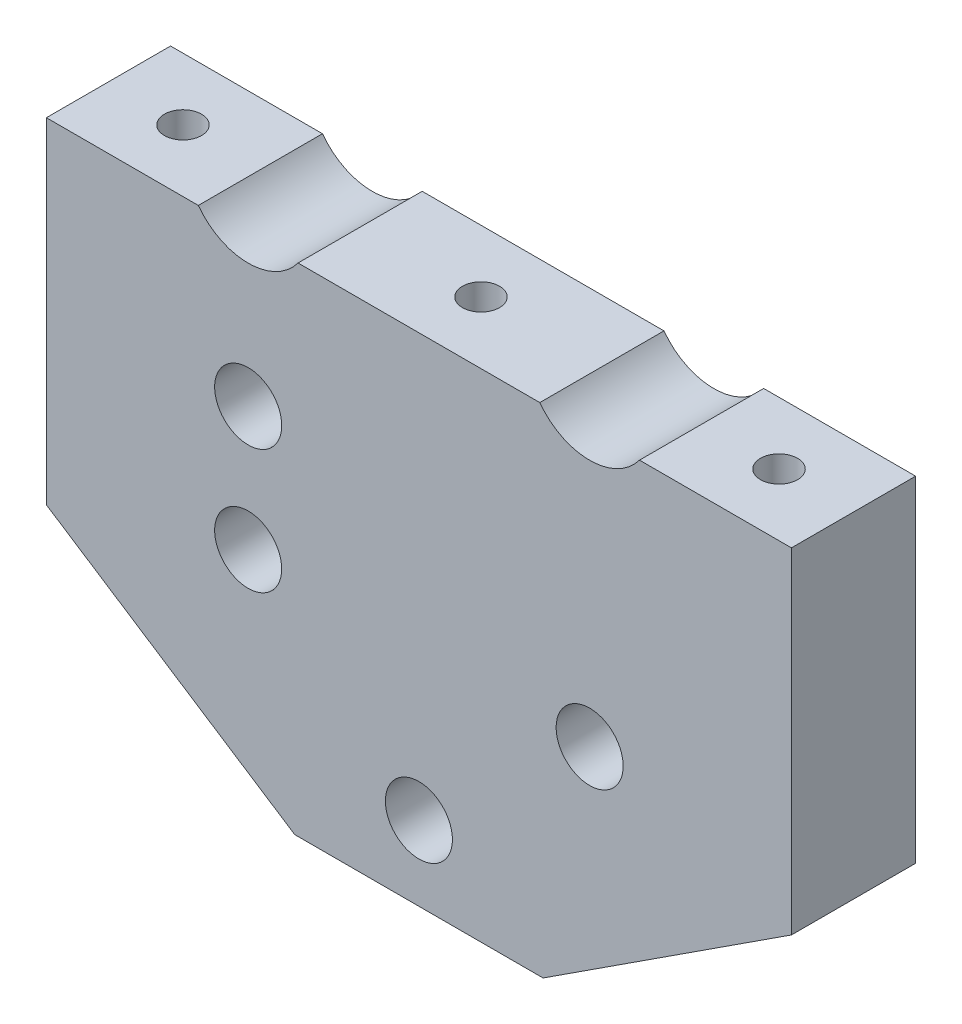
ISO-10303-21;
HEADER;
FILE_DESCRIPTION(('STEP AP214'),'2;1');
FILE_NAME('part.step','',(''),(''),'','','');
FILE_SCHEMA(('AUTOMOTIVE_DESIGN { 1 0 10303 214 1 1 1 1 }'));
ENDSEC;
DATA;
#1=APPLICATION_CONTEXT('core data for automotive mechanical design processes');
#2=APPLICATION_PROTOCOL_DEFINITION('international standard','automotive_design',2000,#1);
#3=PRODUCT_CONTEXT('',#1,'mechanical');
#4=PRODUCT('Part','Part','',(#3));
#5=PRODUCT_RELATED_PRODUCT_CATEGORY('part','',(#4));
#6=PRODUCT_DEFINITION_FORMATION('','',#4);
#7=PRODUCT_DEFINITION_CONTEXT('part definition',#1,'design');
#8=PRODUCT_DEFINITION('design','',#6,#7);
#9=PRODUCT_DEFINITION_SHAPE('','',#8);
#10=(LENGTH_UNIT() NAMED_UNIT(*) SI_UNIT(.MILLI.,.METRE.));
#11=(NAMED_UNIT(*) PLANE_ANGLE_UNIT() SI_UNIT($,.RADIAN.));
#12=(NAMED_UNIT(*) SI_UNIT($,.STERADIAN.) SOLID_ANGLE_UNIT());
#13=UNCERTAINTY_MEASURE_WITH_UNIT(LENGTH_MEASURE(1.E-05),#10,'distance_accuracy_value','');
#14=(GEOMETRIC_REPRESENTATION_CONTEXT(3) GLOBAL_UNCERTAINTY_ASSIGNED_CONTEXT((#13)) GLOBAL_UNIT_ASSIGNED_CONTEXT((#10,
#11,#12)) REPRESENTATION_CONTEXT('',''));
#15=CARTESIAN_POINT('',(0.,0.,0.));
#16=DIRECTION('',(0.,0.,1.));
#17=DIRECTION('',(1.,0.,0.));
#18=AXIS2_PLACEMENT_3D('',#15,#16,#17);
#19=CARTESIAN_POINT('',(-17.4625,20.9296,12.7));
#20=DIRECTION('',(0.,0.,1.));
#21=DIRECTION('',(1.,0.,0.));
#22=AXIS2_PLACEMENT_3D('',#19,#20,#21);
#23=PLANE('',#22);
#24=CARTESIAN_POINT('',(-17.4625,1.905,12.7));
#25=DIRECTION('',(0.,0.,1.));
#26=DIRECTION('',(1.,0.,0.));
#27=AXIS2_PLACEMENT_3D('',#24,#25,#26);
#28=CIRCLE('',#27,3.429);
#29=CARTESIAN_POINT('',(-14.0335,1.905,12.7));
#30=VERTEX_POINT('',#29);
#31=EDGE_CURVE('E271',#30,#30,#28,.T.);
#32=ORIENTED_EDGE('',*,*,#31,.F.);
#33=EDGE_LOOP('',(#32));
#34=FACE_BOUND('',#33,.T.);
#35=CARTESIAN_POINT('',(-17.4625,-10.795,12.7));
#36=DIRECTION('',(0.,0.,1.));
#37=DIRECTION('',(1.,0.,0.));
#38=AXIS2_PLACEMENT_3D('',#35,#36,#37);
#39=CIRCLE('',#38,3.429);
#40=CARTESIAN_POINT('',(-14.0335,-10.795,12.7));
#41=VERTEX_POINT('',#40);
#42=EDGE_CURVE('E172',#41,#41,#39,.T.);
#43=ORIENTED_EDGE('',*,*,#42,.F.);
#44=EDGE_LOOP('',(#43));
#45=FACE_BOUND('',#44,.T.);
#46=DIRECTION('',(-1.,0.,0.));
#47=VECTOR('',#46,1.);
#48=CARTESIAN_POINT('',(22.5614511509721,17.145,12.7));
#49=LINE('',#48,#47);
#50=CARTESIAN_POINT('',(38.1,17.145,12.7));
#51=VERTEX_POINT('',#50);
#52=CARTESIAN_POINT('',(22.5614511509721,17.145,12.7));
#53=VERTEX_POINT('',#52);
#54=EDGE_CURVE('E196',#51,#53,#49,.T.);
#55=ORIENTED_EDGE('',*,*,#54,.T.);
#56=CARTESIAN_POINT('',(17.4625,20.9296,12.7));
#57=DIRECTION('',(0.,0.,-1.));
#58=DIRECTION('',(-1.,0.,0.));
#59=AXIS2_PLACEMENT_3D('',#56,#57,#58);
#60=CIRCLE('',#59,6.35);
#61=CARTESIAN_POINT('',(12.3635488490279,17.145,12.7));
#62=VERTEX_POINT('',#61);
#63=EDGE_CURVE('E118',#53,#62,#60,.T.);
#64=ORIENTED_EDGE('',*,*,#63,.T.);
#65=DIRECTION('',(-1.,0.,0.));
#66=VECTOR('',#65,1.);
#67=CARTESIAN_POINT('',(-12.3635488490279,17.145,12.7));
#68=LINE('',#67,#66);
#69=CARTESIAN_POINT('',(-12.3635488490279,17.145,12.7));
#70=VERTEX_POINT('',#69);
#71=EDGE_CURVE('E225',#62,#70,#68,.T.);
#72=ORIENTED_EDGE('',*,*,#71,.T.);
#73=CARTESIAN_POINT('',(-17.4625,20.9296,12.7));
#74=DIRECTION('',(0.,0.,-1.));
#75=DIRECTION('',(1.,0.,0.));
#76=AXIS2_PLACEMENT_3D('',#73,#74,#75);
#77=CIRCLE('',#76,6.35);
#78=CARTESIAN_POINT('',(-22.5614511509721,17.145,12.7));
#79=VERTEX_POINT('',#78);
#80=EDGE_CURVE('E245',#70,#79,#77,.T.);
#81=ORIENTED_EDGE('',*,*,#80,.T.);
#82=DIRECTION('',(-1.,0.,0.));
#83=VECTOR('',#82,1.);
#84=CARTESIAN_POINT('',(-38.1,17.145,12.7));
#85=LINE('',#84,#83);
#86=CARTESIAN_POINT('',(-38.1,17.145,12.7));
#87=VERTEX_POINT('',#86);
#88=EDGE_CURVE('E241',#79,#87,#85,.T.);
#89=ORIENTED_EDGE('',*,*,#88,.T.);
#90=DIRECTION('',(0.,-1.,0.));
#91=VECTOR('',#90,1.);
#92=CARTESIAN_POINT('',(-38.1,-17.145,12.7));
#93=LINE('',#92,#91);
#94=CARTESIAN_POINT('',(-38.1,-17.145,12.7));
#95=VERTEX_POINT('',#94);
#96=EDGE_CURVE('E244',#87,#95,#93,.T.);
#97=ORIENTED_EDGE('',*,*,#96,.T.);
#98=DIRECTION('',(0.838443616300637,-0.544988350595414,0.));
#99=VECTOR('',#98,1.);
#100=CARTESIAN_POINT('',(-38.1,-17.145,12.7));
#101=LINE('',#100,#99);
#102=CARTESIAN_POINT('',(-12.7,-33.655,12.7));
#103=VERTEX_POINT('',#102);
#104=EDGE_CURVE('E145',#95,#103,#101,.T.);
#105=ORIENTED_EDGE('',*,*,#104,.T.);
#106=DIRECTION('',(1.,0.,0.));
#107=VECTOR('',#106,1.);
#108=CARTESIAN_POINT('',(-12.7,-33.655,12.7));
#109=LINE('',#108,#107);
#110=CARTESIAN_POINT('',(12.7,-33.655,12.7));
#111=VERTEX_POINT('',#110);
#112=EDGE_CURVE('E139',#103,#111,#109,.T.);
#113=ORIENTED_EDGE('',*,*,#112,.T.);
#114=DIRECTION('',(0.838443616300638,0.544988350595414,0.));
#115=VECTOR('',#114,1.);
#116=CARTESIAN_POINT('',(38.1,-17.145,12.7));
#117=LINE('',#116,#115);
#118=CARTESIAN_POINT('',(38.1,-17.145,12.7));
#119=VERTEX_POINT('',#118);
#120=EDGE_CURVE('E143',#111,#119,#117,.T.);
#121=ORIENTED_EDGE('',*,*,#120,.T.);
#122=DIRECTION('',(0.,1.,0.));
#123=VECTOR('',#122,1.);
#124=CARTESIAN_POINT('',(38.1,-17.145,12.7));
#125=LINE('',#124,#123);
#126=EDGE_CURVE('E68',#119,#51,#125,.T.);
#127=ORIENTED_EDGE('',*,*,#126,.T.);
#128=EDGE_LOOP('',(#55,#64,#72,#81,#89,#97,#105,#113,#121,#127));
#129=FACE_BOUND('',#128,.T.);
#130=CARTESIAN_POINT('',(17.4625,-10.795,12.7));
#131=DIRECTION('',(0.,0.,1.));
#132=DIRECTION('',(-1.,0.,0.));
#133=AXIS2_PLACEMENT_3D('',#130,#131,#132);
#134=CIRCLE('',#133,3.429);
#135=CARTESIAN_POINT('',(14.0335,-10.795,12.7));
#136=VERTEX_POINT('',#135);
#137=EDGE_CURVE('E263',#136,#136,#134,.T.);
#138=ORIENTED_EDGE('',*,*,#137,.F.);
#139=EDGE_LOOP('',(#138));
#140=FACE_BOUND('',#139,.T.);
#141=CARTESIAN_POINT('',(0.,-26.035,12.7));
#142=DIRECTION('',(0.,0.,1.));
#143=DIRECTION('',(1.,0.,0.));
#144=AXIS2_PLACEMENT_3D('',#141,#142,#143);
#145=CIRCLE('',#144,3.429);
#146=CARTESIAN_POINT('',(3.42900000000001,-26.035,12.7));
#147=VERTEX_POINT('',#146);
#148=EDGE_CURVE('E279',#147,#147,#145,.T.);
#149=ORIENTED_EDGE('',*,*,#148,.F.);
#150=EDGE_LOOP('',(#149));
#151=FACE_BOUND('',#150,.T.);
#152=ADVANCED_FACE('F50',(#34,#45,#129,#140,#151),#23,.T.);
#153=CARTESIAN_POINT('',(-17.4625,20.9296,0.));
#154=DIRECTION('',(0.,0.,1.));
#155=DIRECTION('',(1.,0.,0.));
#156=AXIS2_PLACEMENT_3D('',#153,#154,#155);
#157=PLANE('',#156);
#158=DIRECTION('',(-1.,0.,0.));
#159=VECTOR('',#158,1.);
#160=CARTESIAN_POINT('',(22.5614511509721,17.145,0.));
#161=LINE('',#160,#159);
#162=CARTESIAN_POINT('',(38.1,17.145,0.));
#163=VERTEX_POINT('',#162);
#164=CARTESIAN_POINT('',(22.5614511509721,17.145,0.));
#165=VERTEX_POINT('',#164);
#166=EDGE_CURVE('E167',#163,#165,#161,.T.);
#167=ORIENTED_EDGE('',*,*,#166,.F.);
#168=DIRECTION('',(0.,1.,0.));
#169=VECTOR('',#168,1.);
#170=CARTESIAN_POINT('',(38.1,-17.145,0.));
#171=LINE('',#170,#169);
#172=CARTESIAN_POINT('',(38.1,-17.145,0.));
#173=VERTEX_POINT('',#172);
#174=EDGE_CURVE('E110',#173,#163,#171,.T.);
#175=ORIENTED_EDGE('',*,*,#174,.F.);
#176=DIRECTION('',(0.838443616300638,0.544988350595414,0.));
#177=VECTOR('',#176,1.);
#178=CARTESIAN_POINT('',(38.1,-17.145,0.));
#179=LINE('',#178,#177);
#180=CARTESIAN_POINT('',(12.7,-33.655,0.));
#181=VERTEX_POINT('',#180);
#182=EDGE_CURVE('E104',#181,#173,#179,.T.);
#183=ORIENTED_EDGE('',*,*,#182,.F.);
#184=DIRECTION('',(1.,0.,0.));
#185=VECTOR('',#184,1.);
#186=CARTESIAN_POINT('',(-12.7,-33.655,0.));
#187=LINE('',#186,#185);
#188=CARTESIAN_POINT('',(-12.7,-33.655,0.));
#189=VERTEX_POINT('',#188);
#190=EDGE_CURVE('E154',#189,#181,#187,.T.);
#191=ORIENTED_EDGE('',*,*,#190,.F.);
#192=DIRECTION('',(0.838443616300637,-0.544988350595414,0.));
#193=VECTOR('',#192,1.);
#194=CARTESIAN_POINT('',(-38.1,-17.145,0.));
#195=LINE('',#194,#193);
#196=CARTESIAN_POINT('',(-38.1,-17.145,0.));
#197=VERTEX_POINT('',#196);
#198=EDGE_CURVE('E187',#197,#189,#195,.T.);
#199=ORIENTED_EDGE('',*,*,#198,.F.);
#200=DIRECTION('',(0.,-1.,0.));
#201=VECTOR('',#200,1.);
#202=CARTESIAN_POINT('',(-38.1,-17.145,0.));
#203=LINE('',#202,#201);
#204=CARTESIAN_POINT('',(-38.1,17.145,0.));
#205=VERTEX_POINT('',#204);
#206=EDGE_CURVE('E184',#205,#197,#203,.T.);
#207=ORIENTED_EDGE('',*,*,#206,.F.);
#208=DIRECTION('',(-1.,0.,0.));
#209=VECTOR('',#208,1.);
#210=CARTESIAN_POINT('',(-38.1,17.145,0.));
#211=LINE('',#210,#209);
#212=CARTESIAN_POINT('',(-22.5614511509721,17.145,0.));
#213=VERTEX_POINT('',#212);
#214=EDGE_CURVE('E181',#213,#205,#211,.T.);
#215=ORIENTED_EDGE('',*,*,#214,.F.);
#216=CARTESIAN_POINT('',(-17.4625,20.9296,0.));
#217=DIRECTION('',(0.,0.,-1.));
#218=DIRECTION('',(1.,0.,0.));
#219=AXIS2_PLACEMENT_3D('',#216,#217,#218);
#220=CIRCLE('',#219,6.35);
#221=CARTESIAN_POINT('',(-12.3635488490279,17.145,0.));
#222=VERTEX_POINT('',#221);
#223=EDGE_CURVE('E178',#222,#213,#220,.T.);
#224=ORIENTED_EDGE('',*,*,#223,.F.);
#225=DIRECTION('',(-1.,0.,0.));
#226=VECTOR('',#225,1.);
#227=CARTESIAN_POINT('',(-12.3635488490279,17.145,0.));
#228=LINE('',#227,#226);
#229=CARTESIAN_POINT('',(12.3635488490279,17.145,0.));
#230=VERTEX_POINT('',#229);
#231=EDGE_CURVE('E175',#230,#222,#228,.T.);
#232=ORIENTED_EDGE('',*,*,#231,.F.);
#233=CARTESIAN_POINT('',(17.4625,20.9296,0.));
#234=DIRECTION('',(0.,0.,-1.));
#235=DIRECTION('',(-1.,0.,0.));
#236=AXIS2_PLACEMENT_3D('',#233,#234,#235);
#237=CIRCLE('',#236,6.35);
#238=EDGE_CURVE('E171',#165,#230,#237,.T.);
#239=ORIENTED_EDGE('',*,*,#238,.F.);
#240=EDGE_LOOP('',(#167,#175,#183,#191,#199,#207,#215,#224,#232,#239));
#241=FACE_BOUND('',#240,.T.);
#242=CARTESIAN_POINT('',(-17.4625,-10.795,0.));
#243=DIRECTION('',(0.,0.,1.));
#244=DIRECTION('',(1.,0.,0.));
#245=AXIS2_PLACEMENT_3D('',#242,#243,#244);
#246=CIRCLE('',#245,3.429);
#247=CARTESIAN_POINT('',(-14.0335,-10.795,0.));
#248=VERTEX_POINT('',#247);
#249=EDGE_CURVE('E259',#248,#248,#246,.T.);
#250=ORIENTED_EDGE('',*,*,#249,.T.);
#251=EDGE_LOOP('',(#250));
#252=FACE_BOUND('',#251,.T.);
#253=CARTESIAN_POINT('',(17.4625,-10.795,0.));
#254=DIRECTION('',(0.,0.,1.));
#255=DIRECTION('',(-1.,0.,0.));
#256=AXIS2_PLACEMENT_3D('',#253,#254,#255);
#257=CIRCLE('',#256,3.429);
#258=CARTESIAN_POINT('',(14.0335,-10.795,0.));
#259=VERTEX_POINT('',#258);
#260=EDGE_CURVE('E267',#259,#259,#257,.T.);
#261=ORIENTED_EDGE('',*,*,#260,.T.);
#262=EDGE_LOOP('',(#261));
#263=FACE_BOUND('',#262,.T.);
#264=CARTESIAN_POINT('',(-17.4625,1.905,0.));
#265=DIRECTION('',(0.,0.,1.));
#266=DIRECTION('',(1.,0.,0.));
#267=AXIS2_PLACEMENT_3D('',#264,#265,#266);
#268=CIRCLE('',#267,3.429);
#269=CARTESIAN_POINT('',(-14.0335,1.905,0.));
#270=VERTEX_POINT('',#269);
#271=EDGE_CURVE('E275',#270,#270,#268,.T.);
#272=ORIENTED_EDGE('',*,*,#271,.T.);
#273=EDGE_LOOP('',(#272));
#274=FACE_BOUND('',#273,.T.);
#275=CARTESIAN_POINT('',(0.,-26.035,0.));
#276=DIRECTION('',(0.,0.,1.));
#277=DIRECTION('',(1.,0.,0.));
#278=AXIS2_PLACEMENT_3D('',#275,#276,#277);
#279=CIRCLE('',#278,3.429);
#280=CARTESIAN_POINT('',(3.42900000000001,-26.035,0.));
#281=VERTEX_POINT('',#280);
#282=EDGE_CURVE('E283',#281,#281,#279,.T.);
#283=ORIENTED_EDGE('',*,*,#282,.T.);
#284=EDGE_LOOP('',(#283));
#285=FACE_BOUND('',#284,.T.);
#286=ADVANCED_FACE('F229',(#241,#252,#263,#274,#285),#157,.F.);
#287=CARTESIAN_POINT('',(22.5614511509721,17.145,12.7));
#288=DIRECTION('',(0.,-1.,0.));
#289=DIRECTION('',(0.,0.,-1.));
#290=AXIS2_PLACEMENT_3D('',#287,#288,#289);
#291=PLANE('',#290);
#292=CARTESIAN_POINT('',(30.48,17.145,6.35000000000001));
#293=DIRECTION('',(0.,1.,0.));
#294=DIRECTION('',(0.,0.,1.));
#295=AXIS2_PLACEMENT_3D('',#292,#293,#294);
#296=CIRCLE('',#295,1.89864999999999);
#297=CARTESIAN_POINT('',(30.48,17.145,8.24865));
#298=VERTEX_POINT('',#297);
#299=EDGE_CURVE('E302',#298,#298,#296,.T.);
#300=ORIENTED_EDGE('',*,*,#299,.F.);
#301=EDGE_LOOP('',(#300));
#302=FACE_BOUND('',#301,.T.);
#303=ORIENTED_EDGE('',*,*,#166,.T.);
#304=DIRECTION('',(0.,0.,-1.));
#305=VECTOR('',#304,1.);
#306=CARTESIAN_POINT('',(22.5614511509721,17.145,12.7));
#307=LINE('',#306,#305);
#308=EDGE_CURVE('E11',#53,#165,#307,.T.);
#309=ORIENTED_EDGE('',*,*,#308,.F.);
#310=ORIENTED_EDGE('',*,*,#54,.F.);
#311=DIRECTION('',(0.,0.,-1.));
#312=VECTOR('',#311,1.);
#313=CARTESIAN_POINT('',(38.1,17.145,12.7));
#314=LINE('',#313,#312);
#315=EDGE_CURVE('E163',#51,#163,#314,.T.);
#316=ORIENTED_EDGE('',*,*,#315,.T.);
#317=EDGE_LOOP('',(#303,#309,#310,#316));
#318=FACE_BOUND('',#317,.T.);
#319=ADVANCED_FACE('F52',(#302,#318),#291,.F.);
#320=CARTESIAN_POINT('',(17.4625,20.9296,12.7));
#321=DIRECTION('',(0.,0.,-1.));
#322=DIRECTION('',(-1.,0.,0.));
#323=AXIS2_PLACEMENT_3D('',#320,#321,#322);
#324=CYLINDRICAL_SURFACE('',#323,6.35);
#325=ORIENTED_EDGE('',*,*,#238,.T.);
#326=DIRECTION('',(0.,0.,-1.));
#327=VECTOR('',#326,1.);
#328=CARTESIAN_POINT('',(12.3635488490279,17.145,12.7));
#329=LINE('',#328,#327);
#330=EDGE_CURVE('E60',#62,#230,#329,.T.);
#331=ORIENTED_EDGE('',*,*,#330,.F.);
#332=ORIENTED_EDGE('',*,*,#63,.F.);
#333=ORIENTED_EDGE('',*,*,#308,.T.);
#334=EDGE_LOOP('',(#325,#331,#332,#333));
#335=FACE_BOUND('',#334,.T.);
#336=ADVANCED_FACE('F318',(#335),#324,.F.);
#337=CARTESIAN_POINT('',(-12.3635488490279,17.145,12.7));
#338=DIRECTION('',(0.,-1.,0.));
#339=DIRECTION('',(0.,0.,-1.));
#340=AXIS2_PLACEMENT_3D('',#337,#338,#339);
#341=PLANE('',#340);
#342=CARTESIAN_POINT('',(0.,17.145,6.35));
#343=DIRECTION('',(0.,1.,0.));
#344=DIRECTION('',(0.,0.,1.));
#345=AXIS2_PLACEMENT_3D('',#342,#343,#344);
#346=CIRCLE('',#345,1.89864999999999);
#347=CARTESIAN_POINT('',(0.,17.145,8.24864999999999));
#348=VERTEX_POINT('',#347);
#349=EDGE_CURVE('E310',#348,#348,#346,.T.);
#350=ORIENTED_EDGE('',*,*,#349,.F.);
#351=EDGE_LOOP('',(#350));
#352=FACE_BOUND('',#351,.T.);
#353=ORIENTED_EDGE('',*,*,#231,.T.);
#354=DIRECTION('',(0.,0.,-1.));
#355=VECTOR('',#354,1.);
#356=CARTESIAN_POINT('',(-12.3635488490279,17.145,12.7));
#357=LINE('',#356,#355);
#358=EDGE_CURVE('E215',#70,#222,#357,.T.);
#359=ORIENTED_EDGE('',*,*,#358,.F.);
#360=ORIENTED_EDGE('',*,*,#71,.F.);
#361=ORIENTED_EDGE('',*,*,#330,.T.);
#362=EDGE_LOOP('',(#353,#359,#360,#361));
#363=FACE_BOUND('',#362,.T.);
#364=ADVANCED_FACE('F223',(#352,#363),#341,.F.);
#365=CARTESIAN_POINT('',(-17.4625,20.9296,12.7));
#366=DIRECTION('',(0.,0.,-1.));
#367=DIRECTION('',(-1.,0.,0.));
#368=AXIS2_PLACEMENT_3D('',#365,#366,#367);
#369=CYLINDRICAL_SURFACE('',#368,6.35);
#370=ORIENTED_EDGE('',*,*,#223,.T.);
#371=DIRECTION('',(0.,0.,-1.));
#372=VECTOR('',#371,1.);
#373=CARTESIAN_POINT('',(-22.5614511509721,17.145,12.7));
#374=LINE('',#373,#372);
#375=EDGE_CURVE('E211',#79,#213,#374,.T.);
#376=ORIENTED_EDGE('',*,*,#375,.F.);
#377=ORIENTED_EDGE('',*,*,#80,.F.);
#378=ORIENTED_EDGE('',*,*,#358,.T.);
#379=EDGE_LOOP('',(#370,#376,#377,#378));
#380=FACE_BOUND('',#379,.T.);
#381=ADVANCED_FACE('F235',(#380),#369,.F.);
#382=CARTESIAN_POINT('',(-38.1,17.145,12.7));
#383=DIRECTION('',(0.,-1.,0.));
#384=DIRECTION('',(0.,0.,-1.));
#385=AXIS2_PLACEMENT_3D('',#382,#383,#384);
#386=PLANE('',#385);
#387=CARTESIAN_POINT('',(-30.48,17.145,6.35000000000001));
#388=DIRECTION('',(0.,1.,0.));
#389=DIRECTION('',(0.,0.,1.));
#390=AXIS2_PLACEMENT_3D('',#387,#388,#389);
#391=CIRCLE('',#390,1.89864999999999);
#392=CARTESIAN_POINT('',(-30.48,17.145,8.24865));
#393=VERTEX_POINT('',#392);
#394=EDGE_CURVE('E294',#393,#393,#391,.T.);
#395=ORIENTED_EDGE('',*,*,#394,.F.);
#396=EDGE_LOOP('',(#395));
#397=FACE_BOUND('',#396,.T.);
#398=ORIENTED_EDGE('',*,*,#214,.T.);
#399=DIRECTION('',(0.,0.,-1.));
#400=VECTOR('',#399,1.);
#401=CARTESIAN_POINT('',(-38.1,17.145,12.7));
#402=LINE('',#401,#400);
#403=EDGE_CURVE('E207',#87,#205,#402,.T.);
#404=ORIENTED_EDGE('',*,*,#403,.F.);
#405=ORIENTED_EDGE('',*,*,#88,.F.);
#406=ORIENTED_EDGE('',*,*,#375,.T.);
#407=EDGE_LOOP('',(#398,#404,#405,#406));
#408=FACE_BOUND('',#407,.T.);
#409=ADVANCED_FACE('F239',(#397,#408),#386,.F.);
#410=CARTESIAN_POINT('',(-38.1,-17.145,12.7));
#411=DIRECTION('',(1.,0.,0.));
#412=DIRECTION('',(0.,0.,-1.));
#413=AXIS2_PLACEMENT_3D('',#410,#411,#412);
#414=PLANE('',#413);
#415=ORIENTED_EDGE('',*,*,#206,.T.);
#416=DIRECTION('',(0.,0.,-1.));
#417=VECTOR('',#416,1.);
#418=CARTESIAN_POINT('',(-38.1,-17.145,12.7));
#419=LINE('',#418,#417);
#420=EDGE_CURVE('E203',#95,#197,#419,.T.);
#421=ORIENTED_EDGE('',*,*,#420,.F.);
#422=ORIENTED_EDGE('',*,*,#96,.F.);
#423=ORIENTED_EDGE('',*,*,#403,.T.);
#424=EDGE_LOOP('',(#415,#421,#422,#423));
#425=FACE_BOUND('',#424,.T.);
#426=ADVANCED_FACE('F348',(#425),#414,.F.);
#427=CARTESIAN_POINT('',(-38.1,-17.145,12.7));
#428=DIRECTION('',(0.544988350595414,0.838443616300637,0.));
#429=DIRECTION('',(-0.838443616300637,0.544988350595414,0.));
#430=AXIS2_PLACEMENT_3D('',#427,#428,#429);
#431=PLANE('',#430);
#432=ORIENTED_EDGE('',*,*,#198,.T.);
#433=DIRECTION('',(0.,0.,-1.));
#434=VECTOR('',#433,1.);
#435=CARTESIAN_POINT('',(-12.7,-33.655,12.7));
#436=LINE('',#435,#434);
#437=EDGE_CURVE('E156',#103,#189,#436,.T.);
#438=ORIENTED_EDGE('',*,*,#437,.F.);
#439=ORIENTED_EDGE('',*,*,#104,.F.);
#440=ORIENTED_EDGE('',*,*,#420,.T.);
#441=EDGE_LOOP('',(#432,#438,#439,#440));
#442=FACE_BOUND('',#441,.T.);
#443=ADVANCED_FACE('F345',(#442),#431,.F.);
#444=CARTESIAN_POINT('',(-12.7,-33.655,12.7));
#445=DIRECTION('',(0.,1.,0.));
#446=DIRECTION('',(0.,0.,1.));
#447=AXIS2_PLACEMENT_3D('',#444,#445,#446);
#448=PLANE('',#447);
#449=ORIENTED_EDGE('',*,*,#190,.T.);
#450=DIRECTION('',(0.,0.,-1.));
#451=VECTOR('',#450,1.);
#452=CARTESIAN_POINT('',(12.7,-33.655,12.7));
#453=LINE('',#452,#451);
#454=EDGE_CURVE('E151',#111,#181,#453,.T.);
#455=ORIENTED_EDGE('',*,*,#454,.F.);
#456=ORIENTED_EDGE('',*,*,#112,.F.);
#457=ORIENTED_EDGE('',*,*,#437,.T.);
#458=EDGE_LOOP('',(#449,#455,#456,#457));
#459=FACE_BOUND('',#458,.T.);
#460=ADVANCED_FACE('F152',(#459),#448,.F.);
#461=CARTESIAN_POINT('',(38.1,-17.145,12.7));
#462=DIRECTION('',(-0.544988350595414,0.838443616300637,0.));
#463=DIRECTION('',(-0.838443616300637,-0.544988350595414,0.));
#464=AXIS2_PLACEMENT_3D('',#461,#462,#463);
#465=PLANE('',#464);
#466=ORIENTED_EDGE('',*,*,#182,.T.);
#467=DIRECTION('',(0.,0.,-1.));
#468=VECTOR('',#467,1.);
#469=CARTESIAN_POINT('',(38.1,-17.145,12.7));
#470=LINE('',#469,#468);
#471=EDGE_CURVE('E157',#119,#173,#470,.T.);
#472=ORIENTED_EDGE('',*,*,#471,.F.);
#473=ORIENTED_EDGE('',*,*,#120,.F.);
#474=ORIENTED_EDGE('',*,*,#454,.T.);
#475=EDGE_LOOP('',(#466,#472,#473,#474));
#476=FACE_BOUND('',#475,.T.);
#477=ADVANCED_FACE('F159',(#476),#465,.F.);
#478=CARTESIAN_POINT('',(38.1,-17.145,12.7));
#479=DIRECTION('',(-1.,0.,0.));
#480=DIRECTION('',(0.,0.,1.));
#481=AXIS2_PLACEMENT_3D('',#478,#479,#480);
#482=PLANE('',#481);
#483=ORIENTED_EDGE('',*,*,#174,.T.);
#484=ORIENTED_EDGE('',*,*,#315,.F.);
#485=ORIENTED_EDGE('',*,*,#126,.F.);
#486=ORIENTED_EDGE('',*,*,#471,.T.);
#487=EDGE_LOOP('',(#483,#484,#485,#486));
#488=FACE_BOUND('',#487,.T.);
#489=ADVANCED_FACE('F338',(#488),#482,.F.);
#490=CARTESIAN_POINT('',(-17.4625,-10.795,12.7));
#491=DIRECTION('',(0.,0.,-1.));
#492=DIRECTION('',(-1.,0.,0.));
#493=AXIS2_PLACEMENT_3D('',#490,#491,#492);
#494=CYLINDRICAL_SURFACE('',#493,3.429);
#495=ORIENTED_EDGE('',*,*,#42,.T.);
#496=EDGE_LOOP('',(#495));
#497=FACE_BOUND('',#496,.T.);
#498=ORIENTED_EDGE('',*,*,#249,.F.);
#499=EDGE_LOOP('',(#498));
#500=FACE_BOUND('',#499,.T.);
#501=ADVANCED_FACE('F335',(#497,#500),#494,.F.);
#502=CARTESIAN_POINT('',(17.4625,-10.795,12.7));
#503=DIRECTION('',(0.,0.,-1.));
#504=DIRECTION('',(-1.,0.,0.));
#505=AXIS2_PLACEMENT_3D('',#502,#503,#504);
#506=CYLINDRICAL_SURFACE('',#505,3.429);
#507=ORIENTED_EDGE('',*,*,#137,.T.);
#508=EDGE_LOOP('',(#507));
#509=FACE_BOUND('',#508,.T.);
#510=ORIENTED_EDGE('',*,*,#260,.F.);
#511=EDGE_LOOP('',(#510));
#512=FACE_BOUND('',#511,.T.);
#513=ADVANCED_FACE('F386',(#509,#512),#506,.F.);
#514=CARTESIAN_POINT('',(-17.4625,1.905,12.7));
#515=DIRECTION('',(0.,0.,-1.));
#516=DIRECTION('',(-1.,0.,0.));
#517=AXIS2_PLACEMENT_3D('',#514,#515,#516);
#518=CYLINDRICAL_SURFACE('',#517,3.429);
#519=ORIENTED_EDGE('',*,*,#31,.T.);
#520=EDGE_LOOP('',(#519));
#521=FACE_BOUND('',#520,.T.);
#522=ORIENTED_EDGE('',*,*,#271,.F.);
#523=EDGE_LOOP('',(#522));
#524=FACE_BOUND('',#523,.T.);
#525=ADVANCED_FACE('F383',(#521,#524),#518,.F.);
#526=CARTESIAN_POINT('',(0.,-26.035,12.7));
#527=DIRECTION('',(0.,0.,-1.));
#528=DIRECTION('',(-1.,0.,0.));
#529=AXIS2_PLACEMENT_3D('',#526,#527,#528);
#530=CYLINDRICAL_SURFACE('',#529,3.429);
#531=ORIENTED_EDGE('',*,*,#148,.T.);
#532=EDGE_LOOP('',(#531));
#533=FACE_BOUND('',#532,.T.);
#534=ORIENTED_EDGE('',*,*,#282,.F.);
#535=EDGE_LOOP('',(#534));
#536=FACE_BOUND('',#535,.T.);
#537=ADVANCED_FACE('F375',(#533,#536),#530,.F.);
#538=CARTESIAN_POINT('',(-30.48,-1.90499999999999,6.35000000000001));
#539=DIRECTION('',(0.,1.,0.));
#540=DIRECTION('',(0.,0.,1.));
#541=AXIS2_PLACEMENT_3D('',#538,#539,#540);
#542=CONICAL_SURFACE('',#541,1.89864999999999,1.02974425867665);
#543=CARTESIAN_POINT('',(-30.48,-3.04582401431667,6.35000000000001));
#544=VERTEX_POINT('',#543);
#545=VERTEX_LOOP('',#544);
#546=FACE_BOUND('',#545,.T.);
#547=CARTESIAN_POINT('',(-30.48,-1.90499999999999,6.35000000000001));
#548=DIRECTION('',(0.,1.,0.));
#549=DIRECTION('',(0.,0.,1.));
#550=AXIS2_PLACEMENT_3D('',#547,#548,#549);
#551=CIRCLE('',#550,1.89864999999999);
#552=CARTESIAN_POINT('',(-30.48,-1.90499999999999,8.24865));
#553=VERTEX_POINT('',#552);
#554=EDGE_CURVE('E287',#553,#553,#551,.T.);
#555=ORIENTED_EDGE('',*,*,#554,.T.);
#556=EDGE_LOOP('',(#555));
#557=FACE_BOUND('',#556,.T.);
#558=ADVANCED_FACE('F364',(#546,#557),#542,.F.);
#559=CARTESIAN_POINT('',(-30.48,17.145,6.35000000000001));
#560=DIRECTION('',(0.,1.,0.));
#561=DIRECTION('',(0.,0.,1.));
#562=AXIS2_PLACEMENT_3D('',#559,#560,#561);
#563=CYLINDRICAL_SURFACE('',#562,1.89864999999999);
#564=ORIENTED_EDGE('',*,*,#554,.F.);
#565=EDGE_LOOP('',(#564));
#566=FACE_BOUND('',#565,.T.);
#567=ORIENTED_EDGE('',*,*,#394,.T.);
#568=EDGE_LOOP('',(#567));
#569=FACE_BOUND('',#568,.T.);
#570=ADVANCED_FACE('F361',(#566,#569),#563,.F.);
#571=CARTESIAN_POINT('',(30.48,-1.90499999999999,6.35000000000001));
#572=DIRECTION('',(0.,1.,0.));
#573=DIRECTION('',(0.,0.,1.));
#574=AXIS2_PLACEMENT_3D('',#571,#572,#573);
#575=CONICAL_SURFACE('',#574,1.89864999999999,1.02974425867665);
#576=CARTESIAN_POINT('',(30.48,-3.04582401431667,6.35000000000001));
#577=VERTEX_POINT('',#576);
#578=VERTEX_LOOP('',#577);
#579=FACE_BOUND('',#578,.T.);
#580=CARTESIAN_POINT('',(30.48,-1.90499999999999,6.35000000000001));
#581=DIRECTION('',(0.,1.,0.));
#582=DIRECTION('',(0.,0.,1.));
#583=AXIS2_PLACEMENT_3D('',#580,#581,#582);
#584=CIRCLE('',#583,1.89864999999999);
#585=CARTESIAN_POINT('',(30.48,-1.90499999999999,8.24865));
#586=VERTEX_POINT('',#585);
#587=EDGE_CURVE('E298',#586,#586,#584,.T.);
#588=ORIENTED_EDGE('',*,*,#587,.T.);
#589=EDGE_LOOP('',(#588));
#590=FACE_BOUND('',#589,.T.);
#591=ADVANCED_FACE('F363',(#579,#590),#575,.F.);
#592=CARTESIAN_POINT('',(30.48,17.145,6.35000000000001));
#593=DIRECTION('',(0.,1.,0.));
#594=DIRECTION('',(0.,0.,1.));
#595=AXIS2_PLACEMENT_3D('',#592,#593,#594);
#596=CYLINDRICAL_SURFACE('',#595,1.89864999999999);
#597=ORIENTED_EDGE('',*,*,#587,.F.);
#598=EDGE_LOOP('',(#597));
#599=FACE_BOUND('',#598,.T.);
#600=ORIENTED_EDGE('',*,*,#299,.T.);
#601=EDGE_LOOP('',(#600));
#602=FACE_BOUND('',#601,.T.);
#603=ADVANCED_FACE('F371',(#599,#602),#596,.F.);
#604=CARTESIAN_POINT('',(0.,-1.90499999999999,6.35));
#605=DIRECTION('',(0.,1.,0.));
#606=DIRECTION('',(0.,0.,1.));
#607=AXIS2_PLACEMENT_3D('',#604,#605,#606);
#608=CONICAL_SURFACE('',#607,1.89865,1.02974425867665);
#609=CARTESIAN_POINT('',(0.,-3.04582401431667,6.35));
#610=VERTEX_POINT('',#609);
#611=VERTEX_LOOP('',#610);
#612=FACE_BOUND('',#611,.T.);
#613=CARTESIAN_POINT('',(0.,-1.90499999999999,6.35));
#614=DIRECTION('',(0.,1.,0.));
#615=DIRECTION('',(0.,0.,1.));
#616=AXIS2_PLACEMENT_3D('',#613,#614,#615);
#617=CIRCLE('',#616,1.89865);
#618=CARTESIAN_POINT('',(0.,-1.90499999999999,8.24865));
#619=VERTEX_POINT('',#618);
#620=EDGE_CURVE('E306',#619,#619,#617,.T.);
#621=ORIENTED_EDGE('',*,*,#620,.T.);
#622=EDGE_LOOP('',(#621));
#623=FACE_BOUND('',#622,.T.);
#624=ADVANCED_FACE('F505',(#612,#623),#608,.F.);
#625=CARTESIAN_POINT('',(0.,17.145,6.35));
#626=DIRECTION('',(0.,1.,0.));
#627=DIRECTION('',(0.,0.,1.));
#628=AXIS2_PLACEMENT_3D('',#625,#626,#627);
#629=CYLINDRICAL_SURFACE('',#628,1.89864999999999);
#630=ORIENTED_EDGE('',*,*,#620,.F.);
#631=EDGE_LOOP('',(#630));
#632=FACE_BOUND('',#631,.T.);
#633=ORIENTED_EDGE('',*,*,#349,.T.);
#634=EDGE_LOOP('',(#633));
#635=FACE_BOUND('',#634,.T.);
#636=ADVANCED_FACE('F315',(#632,#635),#629,.F.);
#637=CLOSED_SHELL('',(#152,#286,#319,#336,#364,#381,#409,#426,#443,#460,#477,#489,#501,#513,
#525,#537,#558,#570,#591,#603,#624,#636));
#638=MANIFOLD_SOLID_BREP('B2',#637);
#639=ADVANCED_BREP_SHAPE_REPRESENTATION('',(#18,#638),#14);
#640=SHAPE_DEFINITION_REPRESENTATION(#9,#639);
ENDSEC;
END-ISO-10303-21;
